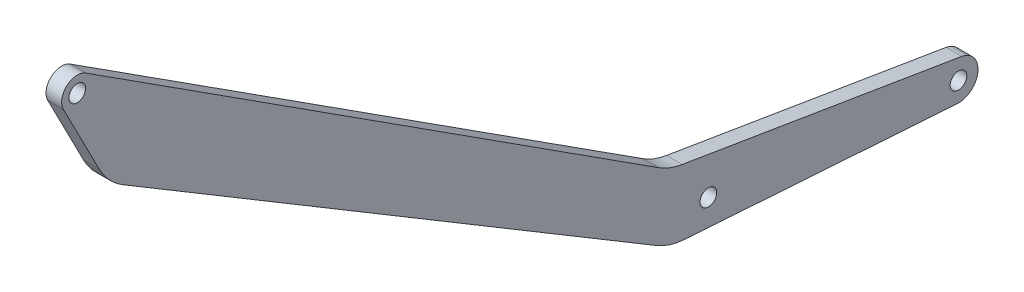
ISO-10303-21;
HEADER;
FILE_DESCRIPTION(('STEP AP214'),'2;1');
FILE_NAME('part.step','',(''),(''),'','','');
FILE_SCHEMA(('AUTOMOTIVE_DESIGN { 1 0 10303 214 1 1 1 1 }'));
ENDSEC;
DATA;
#1=APPLICATION_CONTEXT('core data for automotive mechanical design processes');
#2=APPLICATION_PROTOCOL_DEFINITION('international standard','automotive_design',2000,#1);
#3=PRODUCT_CONTEXT('',#1,'mechanical');
#4=PRODUCT('Part','Part','',(#3));
#5=PRODUCT_RELATED_PRODUCT_CATEGORY('part','',(#4));
#6=PRODUCT_DEFINITION_FORMATION('','',#4);
#7=PRODUCT_DEFINITION_CONTEXT('part definition',#1,'design');
#8=PRODUCT_DEFINITION('design','',#6,#7);
#9=PRODUCT_DEFINITION_SHAPE('','',#8);
#10=(LENGTH_UNIT() NAMED_UNIT(*) SI_UNIT(.MILLI.,.METRE.));
#11=(NAMED_UNIT(*) PLANE_ANGLE_UNIT() SI_UNIT($,.RADIAN.));
#12=(NAMED_UNIT(*) SI_UNIT($,.STERADIAN.) SOLID_ANGLE_UNIT());
#13=UNCERTAINTY_MEASURE_WITH_UNIT(LENGTH_MEASURE(1.E-05),#10,'distance_accuracy_value','');
#14=(GEOMETRIC_REPRESENTATION_CONTEXT(3) GLOBAL_UNCERTAINTY_ASSIGNED_CONTEXT((#13)) GLOBAL_UNIT_ASSIGNED_CONTEXT((#10,
#11,#12)) REPRESENTATION_CONTEXT('',''));
#15=CARTESIAN_POINT('',(0.,0.,0.));
#16=DIRECTION('',(0.,0.,1.));
#17=DIRECTION('',(1.,0.,0.));
#18=AXIS2_PLACEMENT_3D('',#15,#16,#17);
#19=CARTESIAN_POINT('',(-73.7383172811999,915.880591263752,-535.766125100113));
#20=DIRECTION('',(1.,0.,0.));
#21=DIRECTION('',(0.,0.,-1.));
#22=AXIS2_PLACEMENT_3D('',#19,#20,#21);
#23=PLANE('',#22);
#24=CARTESIAN_POINT('',(-73.7383172811999,925.568817609581,-434.166125100113));
#25=DIRECTION('',(1.,0.,0.));
#26=DIRECTION('',(0.,0.,-1.));
#27=AXIS2_PLACEMENT_3D('',#24,#25,#26);
#28=CIRCLE('',#27,3.37819999999999);
#29=CARTESIAN_POINT('',(-73.7383172811999,925.568817609581,-437.544325100113));
#30=VERTEX_POINT('',#29);
#31=EDGE_CURVE('E266',#30,#30,#28,.T.);
#32=ORIENTED_EDGE('',*,*,#31,.F.);
#33=EDGE_LOOP('',(#32));
#34=FACE_BOUND('',#33,.T.);
#35=DIRECTION('',(0.,-0.888968720881199,-0.457967917320466));
#36=VECTOR('',#35,1.);
#37=CARTESIAN_POINT('',(-73.7383172811999,1087.52263294899,-172.155048622404));
#38=LINE('',#37,#36);
#39=CARTESIAN_POINT('',(-73.7383172811999,1087.52263294899,-172.155048622404));
#40=VERTEX_POINT('',#39);
#41=CARTESIAN_POINT('',(-73.7383172811999,1059.09772777885,-186.798639915358));
#42=VERTEX_POINT('',#41);
#43=EDGE_CURVE('E183',#40,#42,#38,.T.);
#44=ORIENTED_EDGE('',*,*,#43,.T.);
#45=CARTESIAN_POINT('',(-73.7383172811999,1070.73011287879,-209.37844542574));
#46=DIRECTION('',(1.,0.,0.));
#47=DIRECTION('',(0.,0.,-1.));
#48=AXIS2_PLACEMENT_3D('',#45,#46,#47);
#49=CIRCLE('',#48,25.4);
#50=CARTESIAN_POINT('',(-73.7383172811999,1048.93756392457,-196.330655954801));
#51=VERTEX_POINT('',#50);
#52=EDGE_CURVE('E157',#42,#51,#49,.T.);
#53=ORIENTED_EDGE('',*,*,#52,.T.);
#54=DIRECTION('',(0.,-0.513692498855877,-0.857974368276352));
#55=VECTOR('',#54,1.);
#56=CARTESIAN_POINT('',(-73.7383172811999,1052.65849089228,-190.115926380903));
#57=LINE('',#56,#55);
#58=CARTESIAN_POINT('',(-73.7383172811999,919.1710411769,-413.068004905433));
#59=VERTEX_POINT('',#58);
#60=EDGE_CURVE('E187',#51,#59,#57,.T.);
#61=ORIENTED_EDGE('',*,*,#60,.T.);
#62=CARTESIAN_POINT('',(-73.7383172811999,940.963590131119,-426.115794376372));
#63=DIRECTION('',(1.,0.,0.));
#64=DIRECTION('',(0.,0.,-1.));
#65=AXIS2_PLACEMENT_3D('',#62,#63,#64);
#66=CIRCLE('',#65,25.4);
#67=CARTESIAN_POINT('',(-73.7383172811999,915.624045688185,-424.364369977612));
#68=VERTEX_POINT('',#67);
#69=EDGE_CURVE('E54',#59,#68,#66,.T.);
#70=ORIENTED_EDGE('',*,*,#69,.T.);
#71=DIRECTION('',(0.,-0.0689537164866356,-0.997619859958031));
#72=VECTOR('',#71,1.);
#73=CARTESIAN_POINT('',(-73.7383172811999,907.961983625335,-535.2188049755));
#74=LINE('',#73,#72);
#75=CARTESIAN_POINT('',(-73.7383172811999,907.961983625335,-535.2188049755));
#76=VERTEX_POINT('',#75);
#77=EDGE_CURVE('E129',#68,#76,#74,.T.);
#78=ORIENTED_EDGE('',*,*,#77,.T.);
#79=CARTESIAN_POINT('',(-73.7383172811999,915.880591263752,-535.766125100113));
#80=DIRECTION('',(1.,0.,0.));
#81=DIRECTION('',(0.,0.,-1.));
#82=AXIS2_PLACEMENT_3D('',#79,#80,#81);
#83=CIRCLE('',#82,7.93750000000004);
#84=CARTESIAN_POINT('',(-73.7383172811999,923.712003677321,-537.059525988698));
#85=VERTEX_POINT('',#84);
#86=EDGE_CURVE('E124',#76,#85,#83,.T.);
#87=ORIENTED_EDGE('',*,*,#86,.T.);
#88=DIRECTION('',(0.,0.162948143443806,0.986634634780381));
#89=VECTOR('',#88,1.);
#90=CARTESIAN_POINT('',(-73.7383172811999,923.712003677321,-537.059525988698));
#91=LINE('',#90,#89);
#92=CARTESIAN_POINT('',(-73.7383172811999,942.471422751933,-423.473128523822));
#93=VERTEX_POINT('',#92);
#94=EDGE_CURVE('E114',#85,#93,#91,.T.);
#95=ORIENTED_EDGE('',*,*,#94,.T.);
#96=CARTESIAN_POINT('',(-73.7383172811999,967.531942475355,-427.612011367294));
#97=DIRECTION('',(1.,0.,0.));
#98=DIRECTION('',(0.,0.,-1.));
#99=AXIS2_PLACEMENT_3D('',#96,#97,#98);
#100=CIRCLE('',#99,25.4);
#101=CARTESIAN_POINT('',(-73.7383172811999,946.168098717012,-413.873518732761));
#102=VERTEX_POINT('',#101);
#103=EDGE_CURVE('E11',#93,#102,#100,.F.);
#104=ORIENTED_EDGE('',*,*,#103,.T.);
#105=DIRECTION('',(0.,0.540885536792643,0.841096210958375));
#106=VECTOR('',#105,1.);
#107=CARTESIAN_POINT('',(-73.7383172811999,943.327259155244,-418.291125100113));
#108=LINE('',#107,#106);
#109=CARTESIAN_POINT('',(-73.7383172811999,1095.77169016356,-181.234623158633));
#110=VERTEX_POINT('',#109);
#111=EDGE_CURVE('E123',#102,#110,#108,.T.);
#112=ORIENTED_EDGE('',*,*,#111,.T.);
#113=CARTESIAN_POINT('',(-73.7383172811999,1090.43072922398,-177.8));
#114=DIRECTION('',(1.,0.,0.));
#115=DIRECTION('',(0.,0.,-1.));
#116=AXIS2_PLACEMENT_3D('',#113,#114,#115);
#117=CIRCLE('',#116,6.3500000000001);
#118=EDGE_CURVE('E181',#110,#40,#117,.T.);
#119=ORIENTED_EDGE('',*,*,#118,.T.);
#120=EDGE_LOOP('',(#44,#53,#61,#70,#78,#87,#95,#104,#112,#119));
#121=FACE_BOUND('',#120,.T.);
#122=CARTESIAN_POINT('',(-73.7383172811999,1090.43072922398,-177.8));
#123=DIRECTION('',(1.,0.,0.));
#124=DIRECTION('',(0.,0.,-1.));
#125=AXIS2_PLACEMENT_3D('',#122,#123,#124);
#126=CIRCLE('',#125,3.37820000000002);
#127=CARTESIAN_POINT('',(-73.7383172811999,1090.43072922398,-181.1782));
#128=VERTEX_POINT('',#127);
#129=EDGE_CURVE('E191',#128,#128,#126,.T.);
#130=ORIENTED_EDGE('',*,*,#129,.F.);
#131=EDGE_LOOP('',(#130));
#132=FACE_BOUND('',#131,.T.);
#133=CARTESIAN_POINT('',(-73.7383172811999,915.880591263752,-535.766125100113));
#134=DIRECTION('',(1.,0.,0.));
#135=DIRECTION('',(0.,0.,-1.));
#136=AXIS2_PLACEMENT_3D('',#133,#134,#135);
#137=CIRCLE('',#136,3.37819999999999);
#138=CARTESIAN_POINT('',(-73.7383172811999,915.880591263752,-539.144325100113));
#139=VERTEX_POINT('',#138);
#140=EDGE_CURVE('E257',#139,#139,#137,.T.);
#141=ORIENTED_EDGE('',*,*,#140,.F.);
#142=EDGE_LOOP('',(#141));
#143=FACE_BOUND('',#142,.T.);
#144=ADVANCED_FACE('F39',(#34,#121,#132,#143),#23,.T.);
#145=CARTESIAN_POINT('',(-80.0883172811999,915.880591263752,-535.766125100113));
#146=DIRECTION('',(1.,0.,0.));
#147=DIRECTION('',(0.,0.,-1.));
#148=AXIS2_PLACEMENT_3D('',#145,#146,#147);
#149=PLANE('',#148);
#150=DIRECTION('',(0.,-0.513692498855877,-0.857974368276352));
#151=VECTOR('',#150,1.);
#152=CARTESIAN_POINT('',(-80.0883172811999,1052.65849089228,-190.115926380903));
#153=LINE('',#152,#151);
#154=CARTESIAN_POINT('',(-80.0883172811999,1048.93756392457,-196.330655954801));
#155=VERTEX_POINT('',#154);
#156=CARTESIAN_POINT('',(-80.0883172811999,919.1710411769,-413.068004905433));
#157=VERTEX_POINT('',#156);
#158=EDGE_CURVE('E199',#155,#157,#153,.T.);
#159=ORIENTED_EDGE('',*,*,#158,.F.);
#160=CARTESIAN_POINT('',(-80.0883172811999,1070.73011287879,-209.37844542574));
#161=DIRECTION('',(1.,0.,0.));
#162=DIRECTION('',(0.,0.,-1.));
#163=AXIS2_PLACEMENT_3D('',#160,#161,#162);
#164=CIRCLE('',#163,25.4);
#165=CARTESIAN_POINT('',(-80.0883172811999,1059.09772777885,-186.798639915358));
#166=VERTEX_POINT('',#165);
#167=EDGE_CURVE('E152',#155,#166,#164,.F.);
#168=ORIENTED_EDGE('',*,*,#167,.T.);
#169=DIRECTION('',(0.,-0.888968720881199,-0.457967917320466));
#170=VECTOR('',#169,1.);
#171=CARTESIAN_POINT('',(-80.0883172811999,1087.52263294899,-172.155048622404));
#172=LINE('',#171,#170);
#173=CARTESIAN_POINT('',(-80.0883172811999,1087.52263294899,-172.155048622404));
#174=VERTEX_POINT('',#173);
#175=EDGE_CURVE('E196',#174,#166,#172,.T.);
#176=ORIENTED_EDGE('',*,*,#175,.F.);
#177=CARTESIAN_POINT('',(-80.0883172811999,1090.43072922398,-177.8));
#178=DIRECTION('',(1.,0.,0.));
#179=DIRECTION('',(0.,0.,-1.));
#180=AXIS2_PLACEMENT_3D('',#177,#178,#179);
#181=CIRCLE('',#180,6.3500000000001);
#182=CARTESIAN_POINT('',(-80.0883172811999,1095.77169016356,-181.234623158633));
#183=VERTEX_POINT('',#182);
#184=EDGE_CURVE('E194',#183,#174,#181,.T.);
#185=ORIENTED_EDGE('',*,*,#184,.F.);
#186=DIRECTION('',(0.,0.540885536792643,0.841096210958375));
#187=VECTOR('',#186,1.);
#188=CARTESIAN_POINT('',(-80.0883172811999,943.327259155244,-418.291125100113));
#189=LINE('',#188,#187);
#190=CARTESIAN_POINT('',(-80.0883172811999,946.168098717012,-413.873518732761));
#191=VERTEX_POINT('',#190);
#192=EDGE_CURVE('E172',#191,#183,#189,.T.);
#193=ORIENTED_EDGE('',*,*,#192,.F.);
#194=CARTESIAN_POINT('',(-80.0883172811999,967.531942475355,-427.612011367294));
#195=DIRECTION('',(1.,0.,0.));
#196=DIRECTION('',(0.,0.,-1.));
#197=AXIS2_PLACEMENT_3D('',#194,#195,#196);
#198=CIRCLE('',#197,25.4);
#199=CARTESIAN_POINT('',(-80.0883172811999,942.471422751933,-423.473128523822));
#200=VERTEX_POINT('',#199);
#201=EDGE_CURVE('E47',#191,#200,#198,.T.);
#202=ORIENTED_EDGE('',*,*,#201,.T.);
#203=DIRECTION('',(0.,0.162948143443806,0.986634634780381));
#204=VECTOR('',#203,1.);
#205=CARTESIAN_POINT('',(-80.0883172811999,923.712003677321,-537.059525988698));
#206=LINE('',#205,#204);
#207=CARTESIAN_POINT('',(-80.0883172811999,923.712003677321,-537.059525988698));
#208=VERTEX_POINT('',#207);
#209=EDGE_CURVE('E170',#208,#200,#206,.T.);
#210=ORIENTED_EDGE('',*,*,#209,.F.);
#211=CARTESIAN_POINT('',(-80.0883172811999,915.880591263752,-535.766125100113));
#212=DIRECTION('',(1.,0.,0.));
#213=DIRECTION('',(0.,0.,-1.));
#214=AXIS2_PLACEMENT_3D('',#211,#212,#213);
#215=CIRCLE('',#214,7.93750000000004);
#216=CARTESIAN_POINT('',(-80.0883172811999,907.961983625335,-535.2188049755));
#217=VERTEX_POINT('',#216);
#218=EDGE_CURVE('E137',#217,#208,#215,.T.);
#219=ORIENTED_EDGE('',*,*,#218,.F.);
#220=DIRECTION('',(0.,-0.0689537164866356,-0.997619859958031));
#221=VECTOR('',#220,1.);
#222=CARTESIAN_POINT('',(-80.0883172811999,907.961983625335,-535.2188049755));
#223=LINE('',#222,#221);
#224=CARTESIAN_POINT('',(-80.0883172811999,915.624045688185,-424.364369977612));
#225=VERTEX_POINT('',#224);
#226=EDGE_CURVE('E133',#225,#217,#223,.T.);
#227=ORIENTED_EDGE('',*,*,#226,.F.);
#228=CARTESIAN_POINT('',(-80.0883172811999,940.963590131119,-426.115794376372));
#229=DIRECTION('',(1.,0.,0.));
#230=DIRECTION('',(0.,0.,-1.));
#231=AXIS2_PLACEMENT_3D('',#228,#229,#230);
#232=CIRCLE('',#231,25.4);
#233=EDGE_CURVE('E150',#225,#157,#232,.F.);
#234=ORIENTED_EDGE('',*,*,#233,.T.);
#235=EDGE_LOOP('',(#159,#168,#176,#185,#193,#202,#210,#219,#227,#234));
#236=FACE_BOUND('',#235,.T.);
#237=CARTESIAN_POINT('',(-80.0883172811999,1090.43072922398,-177.8));
#238=DIRECTION('',(1.,0.,0.));
#239=DIRECTION('',(0.,0.,-1.));
#240=AXIS2_PLACEMENT_3D('',#237,#238,#239);
#241=CIRCLE('',#240,3.37820000000002);
#242=CARTESIAN_POINT('',(-80.0883172811999,1090.43072922398,-181.1782));
#243=VERTEX_POINT('',#242);
#244=EDGE_CURVE('E269',#243,#243,#241,.T.);
#245=ORIENTED_EDGE('',*,*,#244,.T.);
#246=EDGE_LOOP('',(#245));
#247=FACE_BOUND('',#246,.T.);
#248=CARTESIAN_POINT('',(-80.0883172811999,925.568817609581,-434.166125100113));
#249=DIRECTION('',(1.,0.,0.));
#250=DIRECTION('',(0.,0.,-1.));
#251=AXIS2_PLACEMENT_3D('',#248,#249,#250);
#252=CIRCLE('',#251,3.37819999999999);
#253=CARTESIAN_POINT('',(-80.0883172811999,925.568817609581,-437.544325100113));
#254=VERTEX_POINT('',#253);
#255=EDGE_CURVE('E263',#254,#254,#252,.T.);
#256=ORIENTED_EDGE('',*,*,#255,.T.);
#257=EDGE_LOOP('',(#256));
#258=FACE_BOUND('',#257,.T.);
#259=CARTESIAN_POINT('',(-80.0883172811999,915.880591263752,-535.766125100113));
#260=DIRECTION('',(1.,0.,0.));
#261=DIRECTION('',(0.,0.,-1.));
#262=AXIS2_PLACEMENT_3D('',#259,#260,#261);
#263=CIRCLE('',#262,3.37819999999999);
#264=CARTESIAN_POINT('',(-80.0883172811999,915.880591263752,-539.144325100113));
#265=VERTEX_POINT('',#264);
#266=EDGE_CURVE('E260',#265,#265,#263,.T.);
#267=ORIENTED_EDGE('',*,*,#266,.T.);
#268=EDGE_LOOP('',(#267));
#269=FACE_BOUND('',#268,.T.);
#270=ADVANCED_FACE('F168',(#236,#247,#258,#269),#149,.F.);
#271=CARTESIAN_POINT('',(-73.7383172811999,915.880591263752,-535.766125100113));
#272=DIRECTION('',(-1.,0.,0.));
#273=DIRECTION('',(0.,0.,1.));
#274=AXIS2_PLACEMENT_3D('',#271,#272,#273);
#275=CYLINDRICAL_SURFACE('',#274,7.93750000000004);
#276=ORIENTED_EDGE('',*,*,#218,.T.);
#277=DIRECTION('',(-1.,0.,0.));
#278=VECTOR('',#277,1.);
#279=CARTESIAN_POINT('',(-73.7383172811999,923.712003677321,-537.059525988698));
#280=LINE('',#279,#278);
#281=EDGE_CURVE('E119',#85,#208,#280,.T.);
#282=ORIENTED_EDGE('',*,*,#281,.F.);
#283=ORIENTED_EDGE('',*,*,#86,.F.);
#284=DIRECTION('',(-1.,0.,0.));
#285=VECTOR('',#284,1.);
#286=CARTESIAN_POINT('',(-73.7383172811999,907.961983625335,-535.2188049755));
#287=LINE('',#286,#285);
#288=EDGE_CURVE('E190',#76,#217,#287,.T.);
#289=ORIENTED_EDGE('',*,*,#288,.T.);
#290=EDGE_LOOP('',(#276,#282,#283,#289));
#291=FACE_BOUND('',#290,.T.);
#292=ADVANCED_FACE('F135',(#291),#275,.T.);
#293=CARTESIAN_POINT('',(-73.7383172811999,923.712003677321,-537.059525988698));
#294=DIRECTION('',(0.,-0.986634634780381,0.162948143443806));
#295=DIRECTION('',(0.,-0.162948143443806,-0.986634634780382));
#296=AXIS2_PLACEMENT_3D('',#293,#294,#295);
#297=PLANE('',#296);
#298=ORIENTED_EDGE('',*,*,#209,.T.);
#299=DIRECTION('',(-1.,0.,0.));
#300=VECTOR('',#299,1.);
#301=CARTESIAN_POINT('',(-73.7383172811999,942.471422751933,-423.473128523822));
#302=LINE('',#301,#300);
#303=EDGE_CURVE('E122',#200,#93,#302,.F.);
#304=ORIENTED_EDGE('',*,*,#303,.T.);
#305=ORIENTED_EDGE('',*,*,#94,.F.);
#306=ORIENTED_EDGE('',*,*,#281,.T.);
#307=EDGE_LOOP('',(#298,#304,#305,#306));
#308=FACE_BOUND('',#307,.T.);
#309=ADVANCED_FACE('F117',(#308),#297,.F.);
#310=CARTESIAN_POINT('',(-73.7383172811999,943.327259155244,-418.291125100113));
#311=DIRECTION('',(0.,-0.841096210958375,0.540885536792643));
#312=DIRECTION('',(0.,-0.540885536792643,-0.841096210958375));
#313=AXIS2_PLACEMENT_3D('',#310,#311,#312);
#314=PLANE('',#313);
#315=ORIENTED_EDGE('',*,*,#111,.F.);
#316=DIRECTION('',(-1.,0.,0.));
#317=VECTOR('',#316,1.);
#318=CARTESIAN_POINT('',(-80.0883172811999,946.168098717012,-413.873518732761));
#319=LINE('',#318,#317);
#320=EDGE_CURVE('E159',#102,#191,#319,.T.);
#321=ORIENTED_EDGE('',*,*,#320,.T.);
#322=ORIENTED_EDGE('',*,*,#192,.T.);
#323=DIRECTION('',(-1.,0.,0.));
#324=VECTOR('',#323,1.);
#325=CARTESIAN_POINT('',(-73.7383172811999,1095.77169016356,-181.234623158633));
#326=LINE('',#325,#324);
#327=EDGE_CURVE('E139',#110,#183,#326,.T.);
#328=ORIENTED_EDGE('',*,*,#327,.F.);
#329=EDGE_LOOP('',(#315,#321,#322,#328));
#330=FACE_BOUND('',#329,.T.);
#331=ADVANCED_FACE('F178',(#330),#314,.F.);
#332=CARTESIAN_POINT('',(-73.7383172811999,1090.43072922398,-177.8));
#333=DIRECTION('',(-1.,0.,0.));
#334=DIRECTION('',(0.,0.,1.));
#335=AXIS2_PLACEMENT_3D('',#332,#333,#334);
#336=CYLINDRICAL_SURFACE('',#335,6.3500000000001);
#337=ORIENTED_EDGE('',*,*,#184,.T.);
#338=DIRECTION('',(-1.,0.,0.));
#339=VECTOR('',#338,1.);
#340=CARTESIAN_POINT('',(-73.7383172811999,1087.52263294899,-172.155048622404));
#341=LINE('',#340,#339);
#342=EDGE_CURVE('E144',#40,#174,#341,.T.);
#343=ORIENTED_EDGE('',*,*,#342,.F.);
#344=ORIENTED_EDGE('',*,*,#118,.F.);
#345=ORIENTED_EDGE('',*,*,#327,.T.);
#346=EDGE_LOOP('',(#337,#343,#344,#345));
#347=FACE_BOUND('',#346,.T.);
#348=ADVANCED_FACE('F292',(#347),#336,.T.);
#349=CARTESIAN_POINT('',(-73.7383172811999,1087.52263294899,-172.155048622404));
#350=DIRECTION('',(0.,0.457967917320466,-0.888968720881199));
#351=DIRECTION('',(0.,0.888968720881199,0.457967917320466));
#352=AXIS2_PLACEMENT_3D('',#349,#350,#351);
#353=PLANE('',#352);
#354=ORIENTED_EDGE('',*,*,#175,.T.);
#355=DIRECTION('',(-1.,0.,0.));
#356=VECTOR('',#355,1.);
#357=CARTESIAN_POINT('',(-73.7383172811999,1059.09772777885,-186.798639915358));
#358=LINE('',#357,#356);
#359=EDGE_CURVE('E154',#166,#42,#358,.F.);
#360=ORIENTED_EDGE('',*,*,#359,.T.);
#361=ORIENTED_EDGE('',*,*,#43,.F.);
#362=ORIENTED_EDGE('',*,*,#342,.T.);
#363=EDGE_LOOP('',(#354,#360,#361,#362));
#364=FACE_BOUND('',#363,.T.);
#365=ADVANCED_FACE('F208',(#364),#353,.F.);
#366=CARTESIAN_POINT('',(-73.7383172811999,1052.65849089228,-190.115926380903));
#367=DIRECTION('',(0.,0.857974368276351,-0.513692498855877));
#368=DIRECTION('',(0.,0.513692498855877,0.857974368276352));
#369=AXIS2_PLACEMENT_3D('',#366,#367,#368);
#370=PLANE('',#369);
#371=ORIENTED_EDGE('',*,*,#60,.F.);
#372=DIRECTION('',(-1.,0.,0.));
#373=VECTOR('',#372,1.);
#374=CARTESIAN_POINT('',(-73.7383172811999,1048.93756392457,-196.330655954801));
#375=LINE('',#374,#373);
#376=EDGE_CURVE('E141',#51,#155,#375,.T.);
#377=ORIENTED_EDGE('',*,*,#376,.T.);
#378=ORIENTED_EDGE('',*,*,#158,.T.);
#379=DIRECTION('',(-1.,0.,0.));
#380=VECTOR('',#379,1.);
#381=CARTESIAN_POINT('',(-73.7383172811999,919.1710411769,-413.068004905433));
#382=LINE('',#381,#380);
#383=EDGE_CURVE('E138',#157,#59,#382,.F.);
#384=ORIENTED_EDGE('',*,*,#383,.T.);
#385=EDGE_LOOP('',(#371,#377,#378,#384));
#386=FACE_BOUND('',#385,.T.);
#387=ADVANCED_FACE('F217',(#386),#370,.F.);
#388=CARTESIAN_POINT('',(-73.7383172811999,907.961983625335,-535.2188049755));
#389=DIRECTION('',(0.,0.997619859958031,-0.0689537164866356));
#390=DIRECTION('',(0.,0.0689537164866356,0.997619859958031));
#391=AXIS2_PLACEMENT_3D('',#388,#389,#390);
#392=PLANE('',#391);
#393=ORIENTED_EDGE('',*,*,#77,.F.);
#394=DIRECTION('',(-1.,0.,0.));
#395=VECTOR('',#394,1.);
#396=CARTESIAN_POINT('',(-73.7383172811999,915.624045688185,-424.364369977612));
#397=LINE('',#396,#395);
#398=EDGE_CURVE('E163',#68,#225,#397,.T.);
#399=ORIENTED_EDGE('',*,*,#398,.T.);
#400=ORIENTED_EDGE('',*,*,#226,.T.);
#401=ORIENTED_EDGE('',*,*,#288,.F.);
#402=EDGE_LOOP('',(#393,#399,#400,#401));
#403=FACE_BOUND('',#402,.T.);
#404=ADVANCED_FACE('F223',(#403),#392,.F.);
#405=CARTESIAN_POINT('',(-73.7383172811999,1090.43072922398,-177.8));
#406=DIRECTION('',(-1.,0.,0.));
#407=DIRECTION('',(0.,0.,1.));
#408=AXIS2_PLACEMENT_3D('',#405,#406,#407);
#409=CYLINDRICAL_SURFACE('',#408,3.37820000000002);
#410=ORIENTED_EDGE('',*,*,#129,.T.);
#411=EDGE_LOOP('',(#410));
#412=FACE_BOUND('',#411,.T.);
#413=ORIENTED_EDGE('',*,*,#244,.F.);
#414=EDGE_LOOP('',(#413));
#415=FACE_BOUND('',#414,.T.);
#416=ADVANCED_FACE('F225',(#412,#415),#409,.F.);
#417=CARTESIAN_POINT('',(-73.7383172811999,925.568817609581,-434.166125100113));
#418=DIRECTION('',(-1.,0.,0.));
#419=DIRECTION('',(0.,0.,1.));
#420=AXIS2_PLACEMENT_3D('',#417,#418,#419);
#421=CYLINDRICAL_SURFACE('',#420,3.37819999999999);
#422=ORIENTED_EDGE('',*,*,#31,.T.);
#423=EDGE_LOOP('',(#422));
#424=FACE_BOUND('',#423,.T.);
#425=ORIENTED_EDGE('',*,*,#255,.F.);
#426=EDGE_LOOP('',(#425));
#427=FACE_BOUND('',#426,.T.);
#428=ADVANCED_FACE('F232',(#424,#427),#421,.F.);
#429=CARTESIAN_POINT('',(-73.7383172811999,915.880591263752,-535.766125100113));
#430=DIRECTION('',(-1.,0.,0.));
#431=DIRECTION('',(0.,0.,1.));
#432=AXIS2_PLACEMENT_3D('',#429,#430,#431);
#433=CYLINDRICAL_SURFACE('',#432,3.37819999999999);
#434=ORIENTED_EDGE('',*,*,#140,.T.);
#435=EDGE_LOOP('',(#434));
#436=FACE_BOUND('',#435,.T.);
#437=ORIENTED_EDGE('',*,*,#266,.F.);
#438=EDGE_LOOP('',(#437));
#439=FACE_BOUND('',#438,.T.);
#440=ADVANCED_FACE('F248',(#436,#439),#433,.F.);
#441=CARTESIAN_POINT('',(-73.7383172811999,1070.73011287879,-209.37844542574));
#442=DIRECTION('',(-1.,0.,0.));
#443=DIRECTION('',(0.,0.,1.));
#444=AXIS2_PLACEMENT_3D('',#441,#442,#443);
#445=CYLINDRICAL_SURFACE('',#444,25.4);
#446=ORIENTED_EDGE('',*,*,#52,.F.);
#447=ORIENTED_EDGE('',*,*,#359,.F.);
#448=ORIENTED_EDGE('',*,*,#167,.F.);
#449=ORIENTED_EDGE('',*,*,#376,.F.);
#450=EDGE_LOOP('',(#446,#447,#448,#449));
#451=FACE_BOUND('',#450,.T.);
#452=ADVANCED_FACE('F214',(#451),#445,.T.);
#453=CARTESIAN_POINT('',(-73.7383172811999,967.531942475355,-427.612011367294));
#454=DIRECTION('',(1.,0.,0.));
#455=DIRECTION('',(0.,0.,-1.));
#456=AXIS2_PLACEMENT_3D('',#453,#454,#455);
#457=CYLINDRICAL_SURFACE('',#456,25.4);
#458=ORIENTED_EDGE('',*,*,#103,.F.);
#459=ORIENTED_EDGE('',*,*,#303,.F.);
#460=ORIENTED_EDGE('',*,*,#201,.F.);
#461=ORIENTED_EDGE('',*,*,#320,.F.);
#462=EDGE_LOOP('',(#458,#459,#460,#461));
#463=FACE_BOUND('',#462,.T.);
#464=ADVANCED_FACE('F176',(#463),#457,.F.);
#465=CARTESIAN_POINT('',(-73.7383172811999,940.963590131119,-426.115794376372));
#466=DIRECTION('',(-1.,0.,0.));
#467=DIRECTION('',(0.,0.,1.));
#468=AXIS2_PLACEMENT_3D('',#465,#466,#467);
#469=CYLINDRICAL_SURFACE('',#468,25.4);
#470=ORIENTED_EDGE('',*,*,#69,.F.);
#471=ORIENTED_EDGE('',*,*,#383,.F.);
#472=ORIENTED_EDGE('',*,*,#233,.F.);
#473=ORIENTED_EDGE('',*,*,#398,.F.);
#474=EDGE_LOOP('',(#470,#471,#472,#473));
#475=FACE_BOUND('',#474,.T.);
#476=ADVANCED_FACE('F41',(#475),#469,.T.);
#477=CLOSED_SHELL('',(#144,#270,#292,#309,#331,#348,#365,#387,#404,#416,#428,#440,#452,#464,#476));
#478=MANIFOLD_SOLID_BREP('B2',#477);
#479=ADVANCED_BREP_SHAPE_REPRESENTATION('',(#18,#478),#14);
#480=SHAPE_DEFINITION_REPRESENTATION(#9,#479);
ENDSEC;
END-ISO-10303-21;
